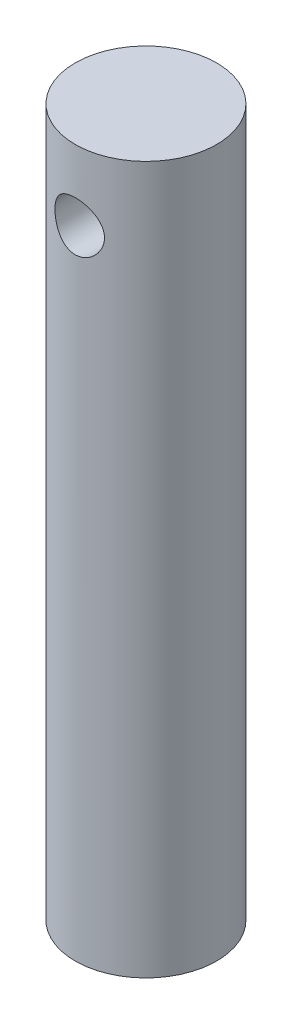
ISO-10303-21;
HEADER;
FILE_DESCRIPTION(('STEP AP214'),'2;1');
FILE_NAME('part.step','',(''),(''),'','','');
FILE_SCHEMA(('AUTOMOTIVE_DESIGN { 1 0 10303 214 1 1 1 1 }'));
ENDSEC;
DATA;
#1=APPLICATION_CONTEXT('core data for automotive mechanical design processes');
#2=APPLICATION_PROTOCOL_DEFINITION('international standard','automotive_design',2000,#1);
#3=PRODUCT_CONTEXT('',#1,'mechanical');
#4=PRODUCT('Part','Part','',(#3));
#5=PRODUCT_RELATED_PRODUCT_CATEGORY('part','',(#4));
#6=PRODUCT_DEFINITION_FORMATION('','',#4);
#7=PRODUCT_DEFINITION_CONTEXT('part definition',#1,'design');
#8=PRODUCT_DEFINITION('design','',#6,#7);
#9=PRODUCT_DEFINITION_SHAPE('','',#8);
#10=(LENGTH_UNIT() NAMED_UNIT(*) SI_UNIT(.MILLI.,.METRE.));
#11=(NAMED_UNIT(*) PLANE_ANGLE_UNIT() SI_UNIT($,.RADIAN.));
#12=(NAMED_UNIT(*) SI_UNIT($,.STERADIAN.) SOLID_ANGLE_UNIT());
#13=UNCERTAINTY_MEASURE_WITH_UNIT(LENGTH_MEASURE(1.E-05),#10,'distance_accuracy_value','');
#14=(GEOMETRIC_REPRESENTATION_CONTEXT(3) GLOBAL_UNCERTAINTY_ASSIGNED_CONTEXT((#13)) GLOBAL_UNIT_ASSIGNED_CONTEXT((#10,
#11,#12)) REPRESENTATION_CONTEXT('',''));
#15=CARTESIAN_POINT('',(0.,0.,0.));
#16=DIRECTION('',(0.,0.,1.));
#17=DIRECTION('',(1.,0.,0.));
#18=AXIS2_PLACEMENT_3D('',#15,#16,#17);
#19=CARTESIAN_POINT('',(-9.99999999999999,-90.,20.));
#20=DIRECTION('',(0.,1.,0.));
#21=DIRECTION('',(0.,0.,1.));
#22=AXIS2_PLACEMENT_3D('',#19,#20,#21);
#23=PLANE('',#22);
#24=CARTESIAN_POINT('',(0.,-90.0000000000001,10.));
#25=DIRECTION('',(0.,1.,0.));
#26=DIRECTION('',(-1.,0.,0.));
#27=AXIS2_PLACEMENT_3D('',#24,#25,#26);
#28=CIRCLE('',#27,10.);
#29=CARTESIAN_POINT('',(-9.99999999999999,-90.0000000000001,10.));
#30=VERTEX_POINT('',#29);
#31=EDGE_CURVE('E108',#30,#30,#28,.T.);
#32=ORIENTED_EDGE('',*,*,#31,.F.);
#33=EDGE_LOOP('',(#32));
#34=FACE_BOUND('',#33,.T.);
#35=ADVANCED_FACE('F93',(#34),#23,.F.);
#36=CARTESIAN_POINT('',(-10.,10.,20.));
#37=DIRECTION('',(0.,-1.,0.));
#38=DIRECTION('',(1.,0.,0.));
#39=AXIS2_PLACEMENT_3D('',#36,#37,#38);
#40=PLANE('',#39);
#41=CARTESIAN_POINT('',(0.,10.,10.));
#42=DIRECTION('',(0.,1.,0.));
#43=DIRECTION('',(-1.,0.,0.));
#44=AXIS2_PLACEMENT_3D('',#41,#42,#43);
#45=CIRCLE('',#44,10.);
#46=CARTESIAN_POINT('',(-10.,10.,10.));
#47=VERTEX_POINT('',#46);
#48=EDGE_CURVE('E112',#47,#47,#45,.T.);
#49=ORIENTED_EDGE('',*,*,#48,.T.);
#50=EDGE_LOOP('',(#49));
#51=FACE_BOUND('',#50,.T.);
#52=ADVANCED_FACE('F128',(#51),#40,.F.);
#53=CARTESIAN_POINT('',(0.,0.,20.));
#54=DIRECTION('',(0.,0.,-1.));
#55=DIRECTION('',(-1.,0.,0.));
#56=AXIS2_PLACEMENT_3D('',#53,#54,#55);
#57=CYLINDRICAL_SURFACE('',#56,3.5);
#58=CARTESIAN_POINT('',(0.,-3.5,0.));
#59=CARTESIAN_POINT('',(-0.0951123395715602,-3.49999932422131,3.63363594273036E-07));
#60=CARTESIAN_POINT('',(-0.190227108788711,-3.49611720413089,0.00136149063528313));
#61=CARTESIAN_POINT('',(-0.379760441093098,-3.48063807363764,0.00676230391333175));
#62=CARTESIAN_POINT('',(-0.474178727512131,-3.46903814844541,0.0108030019133357));
#63=CARTESIAN_POINT('',(-0.755560502236306,-3.42274719752765,0.0268220274090847));
#64=CARTESIAN_POINT('',(-0.940555612673735,-3.37656511531822,0.0426971403122538));
#65=CARTESIAN_POINT('',(-1.29920214527105,-3.25543948631549,0.083111434539037));
#66=CARTESIAN_POINT('',(-1.4728798224539,-3.18056549849141,0.107629650608864));
#67=CARTESIAN_POINT('',(-1.80517956480448,-3.0044427194056,0.162841042945896));
#68=CARTESIAN_POINT('',(-1.96380304686959,-2.90319641366585,0.193533637232069));
#69=CARTESIAN_POINT('',(-2.26752427726035,-2.6731743246489,0.259192936716307));
#70=CARTESIAN_POINT('',(-2.41197527576197,-2.54357660751899,0.294269795509541));
#71=CARTESIAN_POINT('',(-2.67760511032879,-2.26227102845538,0.364164303166688));
#72=CARTESIAN_POINT('',(-2.79877691502712,-2.11055651051016,0.39898187067009));
#73=CARTESIAN_POINT('',(-3.01822993534706,-1.78334504855259,0.4656465143787));
#74=CARTESIAN_POINT('',(-3.11564671580943,-1.60723882846008,0.497361547956115));
#75=CARTESIAN_POINT('',(-3.2791995034771,-1.23985475198404,0.552547638560251));
#76=CARTESIAN_POINT('',(-3.34534629065615,-1.04858215063008,0.576021535905508));
#77=CARTESIAN_POINT('',(-3.4420164141333,-0.663656944068964,0.610905638657318));
#78=CARTESIAN_POINT('',(-3.47375569386538,-0.470348058193603,0.622726176755825));
#79=CARTESIAN_POINT('',(-3.50451196330325,-0.0808148260064827,0.634174280036248));
#80=CARTESIAN_POINT('',(-3.50354033223834,0.115408482714128,0.633806085344964));
#81=CARTESIAN_POINT('',(-3.46984107409105,0.494549046036699,0.621275748945407));
#82=CARTESIAN_POINT('',(-3.43873742717094,0.677634132334746,0.609716760842878));
#83=CARTESIAN_POINT('',(-3.34831919556484,1.03580171497866,0.577100029746791));
#84=CARTESIAN_POINT('',(-3.28900078460467,1.2108831223949,0.556040998448779));
#85=CARTESIAN_POINT('',(-3.14284238816363,1.55161647177313,0.506393317924273));
#86=CARTESIAN_POINT('',(-3.05554426980758,1.71705302793871,0.47768077233962));
#87=CARTESIAN_POINT('',(-2.85621917628193,2.03142038990138,0.416009983037148));
#88=CARTESIAN_POINT('',(-2.74418573525696,2.18034686461684,0.383050630136457));
#89=CARTESIAN_POINT('',(-2.49096340126022,2.46651555213574,0.314274255520215));
#90=CARTESIAN_POINT('',(-2.34846369463469,2.60258502785347,0.278402167437595));
#91=CARTESIAN_POINT('',(-2.04207999810678,2.84930694050015,0.20947016767499));
#92=CARTESIAN_POINT('',(-1.87818653146823,2.95994805317842,0.176411513038492));
#93=CARTESIAN_POINT('',(-1.61854149286258,3.10489314193227,0.131452333825559));
#94=CARTESIAN_POINT('',(-1.52904059766575,3.14993643815032,0.117157007773028));
#95=CARTESIAN_POINT('',(-1.34626526732564,3.23227447940199,0.0906067314967741));
#96=CARTESIAN_POINT('',(-1.25299242148647,3.26957244809906,0.0783509328300207));
#97=CARTESIAN_POINT('',(-1.06348291432433,3.33602684566761,0.0562534751724655));
#98=CARTESIAN_POINT('',(-0.967251129069424,3.36519594749666,0.0464080613205836));
#99=CARTESIAN_POINT('',(-0.772448534315829,3.41517609874369,0.0293994811051257));
#100=CARTESIAN_POINT('',(-0.673878779646222,3.43599084421569,0.0222351287072059));
#101=CARTESIAN_POINT('',(-0.479731930409324,3.46829795433653,0.0110625083329314));
#102=CARTESIAN_POINT('',(-0.3842263318837,3.48017581618116,0.00692398034468104));
#103=CARTESIAN_POINT('',(-0.19248131839903,3.49602718302441,0.00139254160604868));
#104=CARTESIAN_POINT('',(-0.0962419030483594,3.50000068380431,-3.67678939170037E-07));
#105=CARTESIAN_POINT('',(0.0951123395715626,3.49999932422131,3.63363594859801E-07));
#106=CARTESIAN_POINT('',(0.190227108788714,3.49611720413089,0.00136149063528252));
#107=CARTESIAN_POINT('',(0.379760441093102,3.48063807363764,0.00676230391333065));
#108=CARTESIAN_POINT('',(0.474178727512134,3.46903814844541,0.0108030019133353));
#109=CARTESIAN_POINT('',(0.755560502236309,3.42274719752765,0.0268220274090849));
#110=CARTESIAN_POINT('',(0.940555612673738,3.37656511531822,0.0426971403122525));
#111=CARTESIAN_POINT('',(1.29920214527105,3.25543948631549,0.0831114345390356));
#112=CARTESIAN_POINT('',(1.4728798224539,3.18056549849141,0.107629650608864));
#113=CARTESIAN_POINT('',(1.80517956480448,3.0044427194056,0.162841042945896));
#114=CARTESIAN_POINT('',(1.96380304686959,2.90319641366584,0.193533637232068));
#115=CARTESIAN_POINT('',(2.26752427726035,2.67317432464889,0.259192936716306));
#116=CARTESIAN_POINT('',(2.41197527576197,2.54357660751899,0.294269795509543));
#117=CARTESIAN_POINT('',(2.67760511032879,2.26227102845538,0.36416430316669));
#118=CARTESIAN_POINT('',(2.79877691502712,2.11055651051016,0.398981870670091));
#119=CARTESIAN_POINT('',(3.01822993534706,1.78334504855259,0.465646514378701));
#120=CARTESIAN_POINT('',(3.11564671580943,1.60723882846007,0.497361547956117));
#121=CARTESIAN_POINT('',(3.2791995034771,1.23985475198403,0.552547638560253));
#122=CARTESIAN_POINT('',(3.34534629065616,1.04858215063008,0.576021535905508));
#123=CARTESIAN_POINT('',(3.4420164141333,0.663656944068962,0.610905638657316));
#124=CARTESIAN_POINT('',(3.47375569386538,0.470348058193601,0.622726176755824));
#125=CARTESIAN_POINT('',(3.50451196330325,0.080814826006481,0.634174280036248));
#126=CARTESIAN_POINT('',(3.50354033223834,-0.11540848271413,0.633806085344965));
#127=CARTESIAN_POINT('',(3.46984107409105,-0.494549046036702,0.621275748945407));
#128=CARTESIAN_POINT('',(3.43873742717094,-0.677634132334749,0.609716760842876));
#129=CARTESIAN_POINT('',(3.34831919556484,-1.03580171497866,0.577100029746788));
#130=CARTESIAN_POINT('',(3.28900078460467,-1.2108831223949,0.556040998448779));
#131=CARTESIAN_POINT('',(3.14284238816363,-1.55161647177313,0.506393317924275));
#132=CARTESIAN_POINT('',(3.05554426980758,-1.71705302793871,0.477680772339621));
#133=CARTESIAN_POINT('',(2.85621917628193,-2.03142038990138,0.416009983037148));
#134=CARTESIAN_POINT('',(2.74418573525696,-2.18034686461684,0.383050630136456));
#135=CARTESIAN_POINT('',(2.49096340126022,-2.46651555213574,0.314274255520216));
#136=CARTESIAN_POINT('',(2.34846369463469,-2.60258502785347,0.278402167437597));
#137=CARTESIAN_POINT('',(2.04207999810678,-2.84930694050015,0.209470167674992));
#138=CARTESIAN_POINT('',(1.87818653146823,-2.95994805317842,0.176411513038492));
#139=CARTESIAN_POINT('',(1.61854149286258,-3.10489314193227,0.131452333825558));
#140=CARTESIAN_POINT('',(1.52904059766575,-3.14993643815032,0.117157007773028));
#141=CARTESIAN_POINT('',(1.34626526732564,-3.23227447940199,0.0906067314967744));
#142=CARTESIAN_POINT('',(1.25299242148647,-3.26957244809906,0.078350932830021));
#143=CARTESIAN_POINT('',(1.06348291432433,-3.33602684566761,0.0562534751724655));
#144=CARTESIAN_POINT('',(0.967251129069423,-3.36519594749666,0.0464080613205832));
#145=CARTESIAN_POINT('',(0.772448534315827,-3.41517609874369,0.029399481105125));
#146=CARTESIAN_POINT('',(0.67387877964622,-3.43599084421569,0.0222351287072051));
#147=CARTESIAN_POINT('',(0.479731930409323,-3.46829795433653,0.0110625083329319));
#148=CARTESIAN_POINT('',(0.384226331883701,-3.48017581618116,0.0069239803446827));
#149=CARTESIAN_POINT('',(0.192481318399033,-3.49602718302441,0.00139254160604993));
#150=CARTESIAN_POINT('',(0.0962419030483615,-3.50000068380431,-3.67678939460471E-07));
#151=CARTESIAN_POINT('',(0.,-3.5,0.));
#152=B_SPLINE_CURVE_WITH_KNOTS('',3,(#58,#59,#60,#61,#62,#63,#64,#65,#66,#67,#68,#69,#70,#71,
#72,#73,#74,#75,#76,#77,#78,#79,#80,#81,#82,#83,#84,#85,#86,#87,#88,#89,#90,#91,#92,#93,#94,#95,
#96,#97,#98,#99,#100,#101,#102,#103,#104,#105,#106,#107,#108,#109,#110,#111,#112,#113,#114,#115,
#116,#117,#118,#119,#120,#121,#122,#123,#124,#125,#126,#127,#128,#129,#130,#131,#132,#133,#134,
#135,#136,#137,#138,#139,#140,#141,#142,#143,#144,#145,#146,#147,#148,#149,#150,#151),
.UNSPECIFIED.,.T.,.F.,(4,2,2,2,2,2,2,2,2,2,2,2,2,2,2,2,2,2,2,2,2,2,2,2,2,2,2,2,2,2,2,2,2,2,2,2,
2,2,2,2,2,2,2,2,2,2,4),(0.,0.285241631378505,0.570591051380551,1.14157200973058,
1.71117738446175,2.28072909478845,2.86972762303713,3.45890377667695,4.06708445715038,
4.67505532109502,5.26075997856018,5.84626088753469,6.40186638029717,6.95754724159118,
7.52283621202276,8.08827312527261,8.68638930292488,9.2847713313275,9.58808388302718,
9.89126993961983,10.193980648656,10.4965572873216,10.7851863222538,11.0738155112334,
11.3590571426119,11.6444065626139,12.2153875209639,12.7849928956951,13.3545446060218,
13.9435431342705,14.5327192879103,15.1408999683837,15.7488708323284,16.3345754897935,
16.920076398768,17.4756818915305,18.0313627528245,18.5966517232561,19.162088636506,
19.7602048141582,20.3585868425609,20.6618993942605,20.9650854508532,21.2677961598893,
21.5703727985549,21.8590018334872,22.1476310224667),.UNSPECIFIED.);
#153=CARTESIAN_POINT('',(0.,-3.5,0.));
#154=VERTEX_POINT('',#153);
#155=EDGE_CURVE('E104',#154,#154,#152,.T.);
#156=ORIENTED_EDGE('',*,*,#155,.T.);
#157=EDGE_LOOP('',(#156));
#158=FACE_BOUND('',#157,.T.);
#159=CARTESIAN_POINT('',(0.,-3.5,20.));
#160=CARTESIAN_POINT('',(0.0951123395715603,-3.49999932422131,19.9999996366364));
#161=CARTESIAN_POINT('',(0.190227108788711,-3.49611720413089,19.9986385093647));
#162=CARTESIAN_POINT('',(0.379760441093099,-3.48063807363764,19.9932376960867));
#163=CARTESIAN_POINT('',(0.474178727512131,-3.46903814844541,19.9891969980867));
#164=CARTESIAN_POINT('',(0.755560502236306,-3.42274719752765,19.9731779725909));
#165=CARTESIAN_POINT('',(0.940555612673735,-3.37656511531822,19.9573028596877));
#166=CARTESIAN_POINT('',(1.29920214527105,-3.25543948631549,19.916888565461));
#167=CARTESIAN_POINT('',(1.4728798224539,-3.18056549849141,19.8923703493911));
#168=CARTESIAN_POINT('',(1.80517956480448,-3.0044427194056,19.8371589570541));
#169=CARTESIAN_POINT('',(1.96380304686959,-2.90319641366585,19.8064663627679));
#170=CARTESIAN_POINT('',(2.26752427726035,-2.6731743246489,19.7408070632837));
#171=CARTESIAN_POINT('',(2.41197527576197,-2.54357660751899,19.7057302044905));
#172=CARTESIAN_POINT('',(2.67760511032879,-2.26227102845538,19.6358356968333));
#173=CARTESIAN_POINT('',(2.79877691502712,-2.11055651051016,19.6010181293299));
#174=CARTESIAN_POINT('',(3.01822993534706,-1.78334504855259,19.5343534856213));
#175=CARTESIAN_POINT('',(3.11564671580943,-1.60723882846008,19.5026384520439));
#176=CARTESIAN_POINT('',(3.2791995034771,-1.23985475198404,19.4474523614397));
#177=CARTESIAN_POINT('',(3.34534629065615,-1.04858215063008,19.4239784640945));
#178=CARTESIAN_POINT('',(3.4420164141333,-0.663656944068965,19.3890943613427));
#179=CARTESIAN_POINT('',(3.47375569386538,-0.470348058193604,19.3772738232442));
#180=CARTESIAN_POINT('',(3.50451196330325,-0.0808148260064835,19.3658257199638));
#181=CARTESIAN_POINT('',(3.50354033223834,0.115408482714127,19.366193914655));
#182=CARTESIAN_POINT('',(3.46984107409105,0.494549046036698,19.3787242510546));
#183=CARTESIAN_POINT('',(3.43873742717094,0.677634132334746,19.3902832391571));
#184=CARTESIAN_POINT('',(3.34831919556484,1.03580171497866,19.4228999702532));
#185=CARTESIAN_POINT('',(3.28900078460467,1.2108831223949,19.4439590015512));
#186=CARTESIAN_POINT('',(3.14284238816363,1.55161647177312,19.4936066820757));
#187=CARTESIAN_POINT('',(3.05554426980758,1.71705302793871,19.5223192276604));
#188=CARTESIAN_POINT('',(2.85621917628193,2.03142038990137,19.5839900169629));
#189=CARTESIAN_POINT('',(2.74418573525696,2.18034686461684,19.6169493698635));
#190=CARTESIAN_POINT('',(2.49096340126022,2.46651555213574,19.6857257444798));
#191=CARTESIAN_POINT('',(2.34846369463469,2.60258502785347,19.7215978325624));
#192=CARTESIAN_POINT('',(2.04207999810679,2.84930694050015,19.790529832325));
#193=CARTESIAN_POINT('',(1.87818653146823,2.95994805317842,19.8235884869615));
#194=CARTESIAN_POINT('',(1.61854149286258,3.10489314193227,19.8685476661744));
#195=CARTESIAN_POINT('',(1.52904059766576,3.14993643815032,19.882842992227));
#196=CARTESIAN_POINT('',(1.34626526732564,3.23227447940199,19.9093932685032));
#197=CARTESIAN_POINT('',(1.25299242148647,3.26957244809906,19.92164906717));
#198=CARTESIAN_POINT('',(1.06348291432433,3.33602684566761,19.9437465248275));
#199=CARTESIAN_POINT('',(0.967251129069424,3.36519594749666,19.9535919386794));
#200=CARTESIAN_POINT('',(0.772448534315829,3.41517609874369,19.9706005188949));
#201=CARTESIAN_POINT('',(0.673878779646223,3.43599084421569,19.9777648712928));
#202=CARTESIAN_POINT('',(0.479731930409326,3.46829795433653,19.9889374916671));
#203=CARTESIAN_POINT('',(0.384226331883701,3.48017581618116,19.9930760196553));
#204=CARTESIAN_POINT('',(0.192481318399031,3.49602718302441,19.998607458394));
#205=CARTESIAN_POINT('',(0.0962419030483592,3.50000068380431,20.0000003676789));
#206=CARTESIAN_POINT('',(-0.0951123395715632,3.49999932422131,19.9999996366364));
#207=CARTESIAN_POINT('',(-0.190227108788713,3.49611720413089,19.9986385093647));
#208=CARTESIAN_POINT('',(-0.379760441093102,3.48063807363764,19.9932376960867));
#209=CARTESIAN_POINT('',(-0.474178727512134,3.46903814844541,19.9891969980867));
#210=CARTESIAN_POINT('',(-0.75556050223631,3.42274719752765,19.9731779725909));
#211=CARTESIAN_POINT('',(-0.940555612673739,3.37656511531822,19.9573028596877));
#212=CARTESIAN_POINT('',(-1.29920214527105,3.25543948631549,19.916888565461));
#213=CARTESIAN_POINT('',(-1.4728798224539,3.18056549849141,19.8923703493911));
#214=CARTESIAN_POINT('',(-1.80517956480449,3.0044427194056,19.8371589570541));
#215=CARTESIAN_POINT('',(-1.96380304686959,2.90319641366584,19.8064663627679));
#216=CARTESIAN_POINT('',(-2.26752427726036,2.67317432464889,19.7408070632837));
#217=CARTESIAN_POINT('',(-2.41197527576197,2.54357660751899,19.7057302044905));
#218=CARTESIAN_POINT('',(-2.67760511032879,2.26227102845537,19.6358356968333));
#219=CARTESIAN_POINT('',(-2.79877691502712,2.11055651051016,19.6010181293299));
#220=CARTESIAN_POINT('',(-3.01822993534706,1.78334504855259,19.5343534856213));
#221=CARTESIAN_POINT('',(-3.11564671580944,1.60723882846007,19.5026384520439));
#222=CARTESIAN_POINT('',(-3.2791995034771,1.23985475198403,19.4474523614397));
#223=CARTESIAN_POINT('',(-3.34534629065616,1.04858215063008,19.4239784640945));
#224=CARTESIAN_POINT('',(-3.4420164141333,0.663656944068961,19.3890943613427));
#225=CARTESIAN_POINT('',(-3.47375569386538,0.4703480581936,19.3772738232442));
#226=CARTESIAN_POINT('',(-3.50451196330325,0.0808148260064796,19.3658257199638));
#227=CARTESIAN_POINT('',(-3.50354033223834,-0.115408482714132,19.366193914655));
#228=CARTESIAN_POINT('',(-3.46984107409105,-0.494549046036703,19.3787242510546));
#229=CARTESIAN_POINT('',(-3.43873742717094,-0.67763413233475,19.3902832391571));
#230=CARTESIAN_POINT('',(-3.34831919556484,-1.03580171497867,19.4228999702532));
#231=CARTESIAN_POINT('',(-3.28900078460467,-1.2108831223949,19.4439590015512));
#232=CARTESIAN_POINT('',(-3.14284238816363,-1.55161647177313,19.4936066820757));
#233=CARTESIAN_POINT('',(-3.05554426980758,-1.71705302793871,19.5223192276604));
#234=CARTESIAN_POINT('',(-2.85621917628193,-2.03142038990138,19.5839900169629));
#235=CARTESIAN_POINT('',(-2.74418573525696,-2.18034686461685,19.6169493698635));
#236=CARTESIAN_POINT('',(-2.49096340126022,-2.46651555213574,19.6857257444798));
#237=CARTESIAN_POINT('',(-2.34846369463469,-2.60258502785347,19.7215978325624));
#238=CARTESIAN_POINT('',(-2.04207999810678,-2.84930694050016,19.790529832325));
#239=CARTESIAN_POINT('',(-1.87818653146822,-2.95994805317842,19.8235884869615));
#240=CARTESIAN_POINT('',(-1.61854149286257,-3.10489314193227,19.8685476661744));
#241=CARTESIAN_POINT('',(-1.52904059766575,-3.14993643815032,19.882842992227));
#242=CARTESIAN_POINT('',(-1.34626526732564,-3.23227447940199,19.9093932685032));
#243=CARTESIAN_POINT('',(-1.25299242148647,-3.26957244809906,19.92164906717));
#244=CARTESIAN_POINT('',(-1.06348291432432,-3.33602684566762,19.9437465248275));
#245=CARTESIAN_POINT('',(-0.967251129069419,-3.36519594749666,19.9535919386794));
#246=CARTESIAN_POINT('',(-0.772448534315825,-3.41517609874369,19.9706005188949));
#247=CARTESIAN_POINT('',(-0.673878779646218,-3.43599084421569,19.9777648712928));
#248=CARTESIAN_POINT('',(-0.47973193040932,-3.46829795433653,19.9889374916671));
#249=CARTESIAN_POINT('',(-0.384226331883697,-3.48017581618116,19.9930760196553));
#250=CARTESIAN_POINT('',(-0.19248131839903,-3.49602718302441,19.998607458394));
#251=CARTESIAN_POINT('',(-0.09624190304836,-3.50000068380431,20.0000003676789));
#252=CARTESIAN_POINT('',(0.,-3.5,20.));
#253=B_SPLINE_CURVE_WITH_KNOTS('',3,(#159,#160,#161,#162,#163,#164,#165,#166,#167,#168,#169,
#170,#171,#172,#173,#174,#175,#176,#177,#178,#179,#180,#181,#182,#183,#184,#185,#186,#187,#188,
#189,#190,#191,#192,#193,#194,#195,#196,#197,#198,#199,#200,#201,#202,#203,#204,#205,#206,#207,
#208,#209,#210,#211,#212,#213,#214,#215,#216,#217,#218,#219,#220,#221,#222,#223,#224,#225,#226,
#227,#228,#229,#230,#231,#232,#233,#234,#235,#236,#237,#238,#239,#240,#241,#242,#243,#244,#245,
#246,#247,#248,#249,#250,#251,#252),.UNSPECIFIED.,.T.,.F.,(4,2,2,2,2,2,2,2,2,2,2,2,2,2,2,2,2,2,
2,2,2,2,2,2,2,2,2,2,2,2,2,2,2,2,2,2,2,2,2,2,2,2,2,2,2,2,4),(0.,0.285241631378505,
0.570591051380551,1.14157200973058,1.71117738446175,2.28072909478845,2.86972762303713,
3.45890377667695,4.06708445715038,4.67505532109502,5.26075997856018,5.84626088753469,
6.40186638029717,6.95754724159118,7.52283621202276,8.08827312527261,8.68638930292488,
9.2847713313275,9.58808388302718,9.89126993961983,10.193980648656,10.4965572873216,
10.7851863222538,11.0738155112334,11.3590571426119,11.6444065626139,12.2153875209639,
12.7849928956951,13.3545446060218,13.9435431342705,14.5327192879103,15.1408999683837,
15.7488708323284,16.3345754897935,16.920076398768,17.4756818915305,18.0313627528245,
18.5966517232561,19.162088636506,19.7602048141582,20.3585868425609,20.6618993942605,
20.9650854508532,21.2677961598893,21.5703727985549,21.8590018334872,22.1476310224667),.UNSPECIFIED.);
#254=CARTESIAN_POINT('',(0.,-3.5,20.));
#255=VERTEX_POINT('',#254);
#256=EDGE_CURVE('E11',#255,#255,#253,.T.);
#257=ORIENTED_EDGE('',*,*,#256,.T.);
#258=EDGE_LOOP('',(#257));
#259=FACE_BOUND('',#258,.T.);
#260=ADVANCED_FACE('F118',(#158,#259),#57,.F.);
#261=CARTESIAN_POINT('',(0.,-90.0000000000001,10.));
#262=DIRECTION('',(0.,1.,0.));
#263=DIRECTION('',(-1.,0.,0.));
#264=AXIS2_PLACEMENT_3D('',#261,#262,#263);
#265=CYLINDRICAL_SURFACE('',#264,10.);
#266=ORIENTED_EDGE('',*,*,#48,.F.);
#267=EDGE_LOOP('',(#266));
#268=FACE_BOUND('',#267,.T.);
#269=ORIENTED_EDGE('',*,*,#256,.F.);
#270=EDGE_LOOP('',(#269));
#271=FACE_BOUND('',#270,.T.);
#272=ORIENTED_EDGE('',*,*,#31,.T.);
#273=EDGE_LOOP('',(#272));
#274=FACE_BOUND('',#273,.T.);
#275=ORIENTED_EDGE('',*,*,#155,.F.);
#276=EDGE_LOOP('',(#275));
#277=FACE_BOUND('',#276,.T.);
#278=ADVANCED_FACE('F120',(#268,#271,#274,#277),#265,.T.);
#279=CLOSED_SHELL('',(#35,#52,#260,#278));
#280=MANIFOLD_SOLID_BREP('B2',#279);
#281=ADVANCED_BREP_SHAPE_REPRESENTATION('',(#18,#280),#14);
#282=SHAPE_DEFINITION_REPRESENTATION(#9,#281);
ENDSEC;
END-ISO-10303-21;
